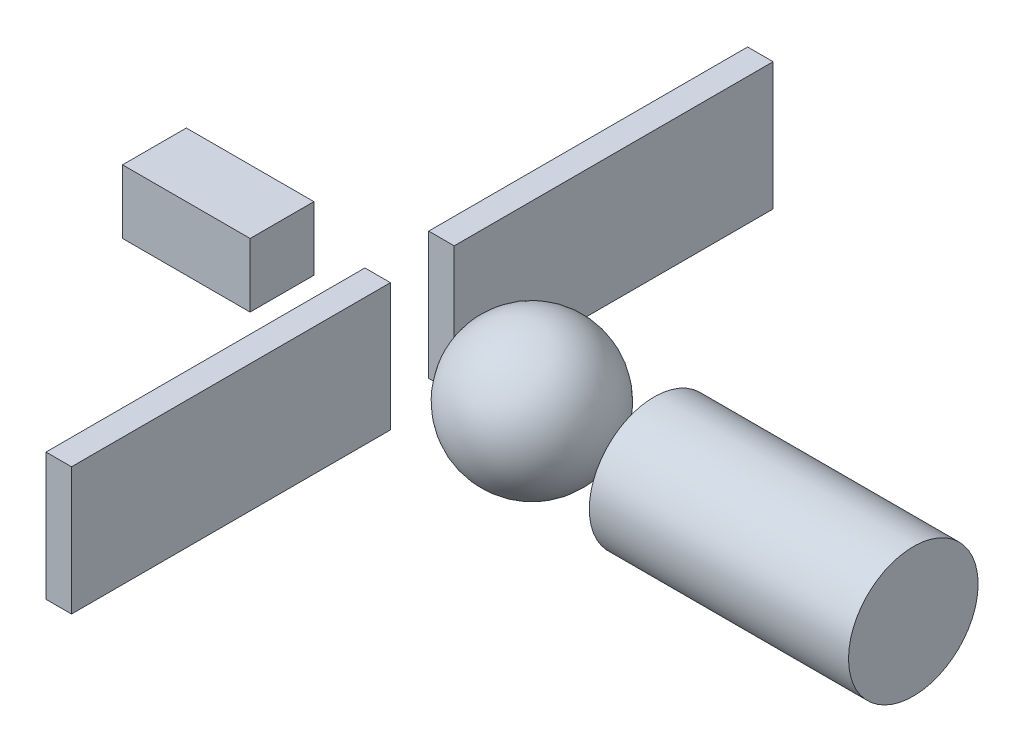
ISO-10303-21;
HEADER;
FILE_DESCRIPTION(('STEP AP214'),'2;1');
FILE_NAME('part.step','',(''),(''),'','','');
FILE_SCHEMA(('AUTOMOTIVE_DESIGN { 1 0 10303 214 1 1 1 1 }'));
ENDSEC;
DATA;
#1=APPLICATION_CONTEXT('core data for automotive mechanical design processes');
#2=APPLICATION_PROTOCOL_DEFINITION('international standard','automotive_design',2000,#1);
#3=PRODUCT_CONTEXT('',#1,'mechanical');
#4=PRODUCT('Part','Part','',(#3));
#5=PRODUCT_RELATED_PRODUCT_CATEGORY('part','',(#4));
#6=PRODUCT_DEFINITION_FORMATION('','',#4);
#7=PRODUCT_DEFINITION_CONTEXT('part definition',#1,'design');
#8=PRODUCT_DEFINITION('design','',#6,#7);
#9=PRODUCT_DEFINITION_SHAPE('','',#8);
#10=(LENGTH_UNIT() NAMED_UNIT(*) SI_UNIT(.MILLI.,.METRE.));
#11=(NAMED_UNIT(*) PLANE_ANGLE_UNIT() SI_UNIT($,.RADIAN.));
#12=(NAMED_UNIT(*) SI_UNIT($,.STERADIAN.) SOLID_ANGLE_UNIT());
#13=UNCERTAINTY_MEASURE_WITH_UNIT(LENGTH_MEASURE(1.E-05),#10,'distance_accuracy_value','');
#14=(GEOMETRIC_REPRESENTATION_CONTEXT(3) GLOBAL_UNCERTAINTY_ASSIGNED_CONTEXT((#13)) GLOBAL_UNIT_ASSIGNED_CONTEXT((#10,
#11,#12)) REPRESENTATION_CONTEXT('',''));
#15=CARTESIAN_POINT('',(0.,0.,0.));
#16=DIRECTION('',(0.,0.,1.));
#17=DIRECTION('',(1.,0.,0.));
#18=AXIS2_PLACEMENT_3D('',#15,#16,#17);
#19=CARTESIAN_POINT('',(9.99999999999998,50.,275.));
#20=DIRECTION('',(-1.,0.,0.));
#21=DIRECTION('',(0.,0.,1.));
#22=AXIS2_PLACEMENT_3D('',#19,#20,#21);
#23=PLANE('',#22);
#24=DIRECTION('',(0.,0.,-1.));
#25=VECTOR('',#24,1.);
#26=CARTESIAN_POINT('',(9.99999999999998,-50.,275.));
#27=LINE('',#26,#25);
#28=CARTESIAN_POINT('',(9.99999999999998,-50.,275.));
#29=VERTEX_POINT('',#28);
#30=CARTESIAN_POINT('',(10.,-50.,25.));
#31=VERTEX_POINT('',#30);
#32=EDGE_CURVE('E107',#29,#31,#27,.T.);
#33=ORIENTED_EDGE('',*,*,#32,.T.);
#34=DIRECTION('',(0.,-1.,0.));
#35=VECTOR('',#34,1.);
#36=CARTESIAN_POINT('',(10.,50.,25.));
#37=LINE('',#36,#35);
#38=CARTESIAN_POINT('',(10.,50.,25.));
#39=VERTEX_POINT('',#38);
#40=EDGE_CURVE('E12',#39,#31,#37,.T.);
#41=ORIENTED_EDGE('',*,*,#40,.F.);
#42=DIRECTION('',(0.,0.,-1.));
#43=VECTOR('',#42,1.);
#44=CARTESIAN_POINT('',(9.99999999999998,50.,275.));
#45=LINE('',#44,#43);
#46=CARTESIAN_POINT('',(9.99999999999998,50.,275.));
#47=VERTEX_POINT('',#46);
#48=EDGE_CURVE('E95',#47,#39,#45,.T.);
#49=ORIENTED_EDGE('',*,*,#48,.F.);
#50=DIRECTION('',(0.,-1.,0.));
#51=VECTOR('',#50,1.);
#52=CARTESIAN_POINT('',(9.99999999999998,50.,275.));
#53=LINE('',#52,#51);
#54=EDGE_CURVE('E103',#47,#29,#53,.T.);
#55=ORIENTED_EDGE('',*,*,#54,.T.);
#56=EDGE_LOOP('',(#33,#41,#49,#55));
#57=FACE_BOUND('',#56,.T.);
#58=ADVANCED_FACE('F44',(#57),#23,.F.);
#59=CARTESIAN_POINT('',(10.,50.,25.));
#60=DIRECTION('',(0.,0.,1.));
#61=DIRECTION('',(1.,0.,0.));
#62=AXIS2_PLACEMENT_3D('',#59,#60,#61);
#63=PLANE('',#62);
#64=DIRECTION('',(-1.,0.,0.));
#65=VECTOR('',#64,1.);
#66=CARTESIAN_POINT('',(10.,-50.,25.));
#67=LINE('',#66,#65);
#68=CARTESIAN_POINT('',(-9.99999999999998,-50.,25.));
#69=VERTEX_POINT('',#68);
#70=EDGE_CURVE('E99',#31,#69,#67,.T.);
#71=ORIENTED_EDGE('',*,*,#70,.T.);
#72=DIRECTION('',(0.,-1.,0.));
#73=VECTOR('',#72,1.);
#74=CARTESIAN_POINT('',(-9.99999999999998,50.,25.));
#75=LINE('',#74,#73);
#76=CARTESIAN_POINT('',(-9.99999999999998,50.,25.));
#77=VERTEX_POINT('',#76);
#78=EDGE_CURVE('E52',#77,#69,#75,.T.);
#79=ORIENTED_EDGE('',*,*,#78,.F.);
#80=DIRECTION('',(-1.,0.,0.));
#81=VECTOR('',#80,1.);
#82=CARTESIAN_POINT('',(10.,50.,25.));
#83=LINE('',#82,#81);
#84=EDGE_CURVE('E90',#39,#77,#83,.T.);
#85=ORIENTED_EDGE('',*,*,#84,.F.);
#86=ORIENTED_EDGE('',*,*,#40,.T.);
#87=EDGE_LOOP('',(#71,#79,#85,#86));
#88=FACE_BOUND('',#87,.T.);
#89=ADVANCED_FACE('F98',(#88),#63,.F.);
#90=CARTESIAN_POINT('',(-10.,50.,275.));
#91=DIRECTION('',(1.,0.,0.));
#92=DIRECTION('',(0.,0.,-1.));
#93=AXIS2_PLACEMENT_3D('',#90,#91,#92);
#94=PLANE('',#93);
#95=DIRECTION('',(0.,0.,1.));
#96=VECTOR('',#95,1.);
#97=CARTESIAN_POINT('',(-10.,-50.,275.));
#98=LINE('',#97,#96);
#99=CARTESIAN_POINT('',(-10.,-50.,275.));
#100=VERTEX_POINT('',#99);
#101=EDGE_CURVE('E77',#69,#100,#98,.T.);
#102=ORIENTED_EDGE('',*,*,#101,.T.);
#103=DIRECTION('',(0.,-1.,0.));
#104=VECTOR('',#103,1.);
#105=CARTESIAN_POINT('',(-10.,50.,275.));
#106=LINE('',#105,#104);
#107=CARTESIAN_POINT('',(-10.,50.,275.));
#108=VERTEX_POINT('',#107);
#109=EDGE_CURVE('E100',#108,#100,#106,.T.);
#110=ORIENTED_EDGE('',*,*,#109,.F.);
#111=DIRECTION('',(0.,0.,1.));
#112=VECTOR('',#111,1.);
#113=CARTESIAN_POINT('',(-10.,50.,275.));
#114=LINE('',#113,#112);
#115=EDGE_CURVE('E93',#77,#108,#114,.T.);
#116=ORIENTED_EDGE('',*,*,#115,.F.);
#117=ORIENTED_EDGE('',*,*,#78,.T.);
#118=EDGE_LOOP('',(#102,#110,#116,#117));
#119=FACE_BOUND('',#118,.T.);
#120=ADVANCED_FACE('F101',(#119),#94,.F.);
#121=CARTESIAN_POINT('',(9.99999999999998,50.,275.));
#122=DIRECTION('',(0.,0.,-1.));
#123=DIRECTION('',(-1.,0.,0.));
#124=AXIS2_PLACEMENT_3D('',#121,#122,#123);
#125=PLANE('',#124);
#126=DIRECTION('',(1.,0.,0.));
#127=VECTOR('',#126,1.);
#128=CARTESIAN_POINT('',(9.99999999999998,-50.,275.));
#129=LINE('',#128,#127);
#130=EDGE_CURVE('E83',#100,#29,#129,.T.);
#131=ORIENTED_EDGE('',*,*,#130,.T.);
#132=ORIENTED_EDGE('',*,*,#54,.F.);
#133=DIRECTION('',(1.,0.,0.));
#134=VECTOR('',#133,1.);
#135=CARTESIAN_POINT('',(9.99999999999998,50.,275.));
#136=LINE('',#135,#134);
#137=EDGE_CURVE('E60',#108,#47,#136,.T.);
#138=ORIENTED_EDGE('',*,*,#137,.F.);
#139=ORIENTED_EDGE('',*,*,#109,.T.);
#140=EDGE_LOOP('',(#131,#132,#138,#139));
#141=FACE_BOUND('',#140,.T.);
#142=ADVANCED_FACE('F114',(#141),#125,.F.);
#143=CARTESIAN_POINT('',(0.,50.,0.));
#144=DIRECTION('',(0.,1.,0.));
#145=DIRECTION('',(0.,0.,1.));
#146=AXIS2_PLACEMENT_3D('',#143,#144,#145);
#147=PLANE('',#146);
#148=ORIENTED_EDGE('',*,*,#48,.T.);
#149=ORIENTED_EDGE('',*,*,#84,.T.);
#150=ORIENTED_EDGE('',*,*,#115,.T.);
#151=ORIENTED_EDGE('',*,*,#137,.T.);
#152=EDGE_LOOP('',(#148,#149,#150,#151));
#153=FACE_BOUND('',#152,.T.);
#154=ADVANCED_FACE('F91',(#153),#147,.T.);
#155=CARTESIAN_POINT('',(0.,-50.,0.));
#156=DIRECTION('',(0.,1.,0.));
#157=DIRECTION('',(0.,0.,1.));
#158=AXIS2_PLACEMENT_3D('',#155,#156,#157);
#159=PLANE('',#158);
#160=ORIENTED_EDGE('',*,*,#32,.F.);
#161=ORIENTED_EDGE('',*,*,#130,.F.);
#162=ORIENTED_EDGE('',*,*,#101,.F.);
#163=ORIENTED_EDGE('',*,*,#70,.F.);
#164=EDGE_LOOP('',(#160,#161,#162,#163));
#165=FACE_BOUND('',#164,.T.);
#166=ADVANCED_FACE('F117',(#165),#159,.F.);
#167=CLOSED_SHELL('',(#58,#89,#120,#142,#154,#166));
#168=MANIFOLD_SOLID_BREP('B2',#167);
#169=CARTESIAN_POINT('',(-10.,50.,-275.));
#170=DIRECTION('',(1.,0.,0.));
#171=DIRECTION('',(0.,0.,-1.));
#172=AXIS2_PLACEMENT_3D('',#169,#170,#171);
#173=PLANE('',#172);
#174=DIRECTION('',(0.,0.,1.));
#175=VECTOR('',#174,1.);
#176=CARTESIAN_POINT('',(-10.,-50.,-275.));
#177=LINE('',#176,#175);
#178=CARTESIAN_POINT('',(-10.,-50.,-275.));
#179=VERTEX_POINT('',#178);
#180=CARTESIAN_POINT('',(-9.99999999999999,-50.,-25.));
#181=VERTEX_POINT('',#180);
#182=EDGE_CURVE('E237',#179,#181,#177,.T.);
#183=ORIENTED_EDGE('',*,*,#182,.T.);
#184=DIRECTION('',(0.,-1.,0.));
#185=VECTOR('',#184,1.);
#186=CARTESIAN_POINT('',(-9.99999999999999,50.,-25.));
#187=LINE('',#186,#185);
#188=CARTESIAN_POINT('',(-9.99999999999999,50.,-25.));
#189=VERTEX_POINT('',#188);
#190=EDGE_CURVE('E42',#189,#181,#187,.T.);
#191=ORIENTED_EDGE('',*,*,#190,.F.);
#192=DIRECTION('',(0.,0.,1.));
#193=VECTOR('',#192,1.);
#194=CARTESIAN_POINT('',(-10.,50.,-275.));
#195=LINE('',#194,#193);
#196=CARTESIAN_POINT('',(-10.,50.,-275.));
#197=VERTEX_POINT('',#196);
#198=EDGE_CURVE('E225',#197,#189,#195,.T.);
#199=ORIENTED_EDGE('',*,*,#198,.F.);
#200=DIRECTION('',(0.,-1.,0.));
#201=VECTOR('',#200,1.);
#202=CARTESIAN_POINT('',(-10.,50.,-275.));
#203=LINE('',#202,#201);
#204=EDGE_CURVE('E233',#197,#179,#203,.T.);
#205=ORIENTED_EDGE('',*,*,#204,.T.);
#206=EDGE_LOOP('',(#183,#191,#199,#205));
#207=FACE_BOUND('',#206,.T.);
#208=ADVANCED_FACE('F174',(#207),#173,.F.);
#209=CARTESIAN_POINT('',(10.,50.,-25.));
#210=DIRECTION('',(0.,0.,-1.));
#211=DIRECTION('',(-1.,0.,0.));
#212=AXIS2_PLACEMENT_3D('',#209,#210,#211);
#213=PLANE('',#212);
#214=DIRECTION('',(1.,0.,0.));
#215=VECTOR('',#214,1.);
#216=CARTESIAN_POINT('',(10.,-50.,-25.));
#217=LINE('',#216,#215);
#218=CARTESIAN_POINT('',(10.,-50.,-25.));
#219=VERTEX_POINT('',#218);
#220=EDGE_CURVE('E229',#181,#219,#217,.T.);
#221=ORIENTED_EDGE('',*,*,#220,.T.);
#222=DIRECTION('',(0.,-1.,0.));
#223=VECTOR('',#222,1.);
#224=CARTESIAN_POINT('',(10.,50.,-25.));
#225=LINE('',#224,#223);
#226=CARTESIAN_POINT('',(10.,50.,-25.));
#227=VERTEX_POINT('',#226);
#228=EDGE_CURVE('E182',#227,#219,#225,.T.);
#229=ORIENTED_EDGE('',*,*,#228,.F.);
#230=DIRECTION('',(1.,0.,0.));
#231=VECTOR('',#230,1.);
#232=CARTESIAN_POINT('',(10.,50.,-25.));
#233=LINE('',#232,#231);
#234=EDGE_CURVE('E220',#189,#227,#233,.T.);
#235=ORIENTED_EDGE('',*,*,#234,.F.);
#236=ORIENTED_EDGE('',*,*,#190,.T.);
#237=EDGE_LOOP('',(#221,#229,#235,#236));
#238=FACE_BOUND('',#237,.T.);
#239=ADVANCED_FACE('F228',(#238),#213,.F.);
#240=CARTESIAN_POINT('',(9.99999999999998,50.,-275.));
#241=DIRECTION('',(-1.,0.,0.));
#242=DIRECTION('',(0.,0.,1.));
#243=AXIS2_PLACEMENT_3D('',#240,#241,#242);
#244=PLANE('',#243);
#245=DIRECTION('',(0.,0.,-1.));
#246=VECTOR('',#245,1.);
#247=CARTESIAN_POINT('',(9.99999999999998,-50.,-275.));
#248=LINE('',#247,#246);
#249=CARTESIAN_POINT('',(9.99999999999998,-50.,-275.));
#250=VERTEX_POINT('',#249);
#251=EDGE_CURVE('E207',#219,#250,#248,.T.);
#252=ORIENTED_EDGE('',*,*,#251,.T.);
#253=DIRECTION('',(0.,-1.,0.));
#254=VECTOR('',#253,1.);
#255=CARTESIAN_POINT('',(9.99999999999998,50.,-275.));
#256=LINE('',#255,#254);
#257=CARTESIAN_POINT('',(9.99999999999998,50.,-275.));
#258=VERTEX_POINT('',#257);
#259=EDGE_CURVE('E230',#258,#250,#256,.T.);
#260=ORIENTED_EDGE('',*,*,#259,.F.);
#261=DIRECTION('',(0.,0.,-1.));
#262=VECTOR('',#261,1.);
#263=CARTESIAN_POINT('',(9.99999999999998,50.,-275.));
#264=LINE('',#263,#262);
#265=EDGE_CURVE('E223',#227,#258,#264,.T.);
#266=ORIENTED_EDGE('',*,*,#265,.F.);
#267=ORIENTED_EDGE('',*,*,#228,.T.);
#268=EDGE_LOOP('',(#252,#260,#266,#267));
#269=FACE_BOUND('',#268,.T.);
#270=ADVANCED_FACE('F231',(#269),#244,.F.);
#271=CARTESIAN_POINT('',(9.99999999999998,50.,-275.));
#272=DIRECTION('',(0.,0.,1.));
#273=DIRECTION('',(1.,0.,0.));
#274=AXIS2_PLACEMENT_3D('',#271,#272,#273);
#275=PLANE('',#274);
#276=DIRECTION('',(-1.,0.,0.));
#277=VECTOR('',#276,1.);
#278=CARTESIAN_POINT('',(9.99999999999998,-50.,-275.));
#279=LINE('',#278,#277);
#280=EDGE_CURVE('E213',#250,#179,#279,.T.);
#281=ORIENTED_EDGE('',*,*,#280,.T.);
#282=ORIENTED_EDGE('',*,*,#204,.F.);
#283=DIRECTION('',(-1.,0.,0.));
#284=VECTOR('',#283,1.);
#285=CARTESIAN_POINT('',(9.99999999999998,50.,-275.));
#286=LINE('',#285,#284);
#287=EDGE_CURVE('E190',#258,#197,#286,.T.);
#288=ORIENTED_EDGE('',*,*,#287,.F.);
#289=ORIENTED_EDGE('',*,*,#259,.T.);
#290=EDGE_LOOP('',(#281,#282,#288,#289));
#291=FACE_BOUND('',#290,.T.);
#292=ADVANCED_FACE('F244',(#291),#275,.F.);
#293=CARTESIAN_POINT('',(0.,50.,0.));
#294=DIRECTION('',(0.,-1.,0.));
#295=DIRECTION('',(0.,0.,-1.));
#296=AXIS2_PLACEMENT_3D('',#293,#294,#295);
#297=PLANE('',#296);
#298=ORIENTED_EDGE('',*,*,#198,.T.);
#299=ORIENTED_EDGE('',*,*,#234,.T.);
#300=ORIENTED_EDGE('',*,*,#265,.T.);
#301=ORIENTED_EDGE('',*,*,#287,.T.);
#302=EDGE_LOOP('',(#298,#299,#300,#301));
#303=FACE_BOUND('',#302,.T.);
#304=ADVANCED_FACE('F221',(#303),#297,.F.);
#305=CARTESIAN_POINT('',(0.,-50.,0.));
#306=DIRECTION('',(0.,-1.,0.));
#307=DIRECTION('',(0.,0.,-1.));
#308=AXIS2_PLACEMENT_3D('',#305,#306,#307);
#309=PLANE('',#308);
#310=ORIENTED_EDGE('',*,*,#182,.F.);
#311=ORIENTED_EDGE('',*,*,#280,.F.);
#312=ORIENTED_EDGE('',*,*,#251,.F.);
#313=ORIENTED_EDGE('',*,*,#220,.F.);
#314=EDGE_LOOP('',(#310,#311,#312,#313));
#315=FACE_BOUND('',#314,.T.);
#316=ADVANCED_FACE('F247',(#315),#309,.T.);
#317=CLOSED_SHELL('',(#208,#239,#270,#292,#304,#316));
#318=MANIFOLD_SOLID_BREP('B6',#317);
#319=CARTESIAN_POINT('',(95.85,0.,0.));
#320=DIRECTION('',(-1.,0.,0.));
#321=DIRECTION('',(0.,0.,-1.));
#322=AXIS2_PLACEMENT_3D('',#319,#320,#321);
#323=SPHERICAL_SURFACE('',#322,55.85);
#324=CARTESIAN_POINT('',(40.,0.,0.));
#325=VERTEX_POINT('',#324);
#326=VERTEX_LOOP('',#325);
#327=FACE_BOUND('',#326,.T.);
#328=ADVANCED_FACE('F306',(#327),#323,.T.);
#329=CLOSED_SHELL('',(#328));
#330=MANIFOLD_SOLID_BREP('B36',#329);
#331=CARTESIAN_POINT('',(394.9,0.,0.));
#332=DIRECTION('',(-1.,0.,0.));
#333=DIRECTION('',(0.,0.,1.));
#334=AXIS2_PLACEMENT_3D('',#331,#332,#333);
#335=PLANE('',#334);
#336=CARTESIAN_POINT('',(394.9,0.,0.));
#337=DIRECTION('',(-1.,0.,0.));
#338=DIRECTION('',(0.,0.,1.));
#339=AXIS2_PLACEMENT_3D('',#336,#337,#338);
#340=CIRCLE('',#339,50.8);
#341=CARTESIAN_POINT('',(394.9,0.,50.8));
#342=VERTEX_POINT('',#341);
#343=EDGE_CURVE('E334',#342,#342,#340,.T.);
#344=ORIENTED_EDGE('',*,*,#343,.F.);
#345=EDGE_LOOP('',(#344));
#346=FACE_BOUND('',#345,.T.);
#347=ADVANCED_FACE('F328',(#346),#335,.F.);
#348=CARTESIAN_POINT('',(191.7,0.,0.));
#349=DIRECTION('',(1.,0.,0.));
#350=DIRECTION('',(0.,0.,-1.));
#351=AXIS2_PLACEMENT_3D('',#348,#349,#350);
#352=PLANE('',#351);
#353=CARTESIAN_POINT('',(191.7,0.,0.));
#354=DIRECTION('',(-1.,0.,0.));
#355=DIRECTION('',(0.,0.,1.));
#356=AXIS2_PLACEMENT_3D('',#353,#354,#355);
#357=CIRCLE('',#356,50.8);
#358=CARTESIAN_POINT('',(191.7,0.,50.8));
#359=VERTEX_POINT('',#358);
#360=EDGE_CURVE('E305',#359,#359,#357,.T.);
#361=ORIENTED_EDGE('',*,*,#360,.T.);
#362=EDGE_LOOP('',(#361));
#363=FACE_BOUND('',#362,.T.);
#364=ADVANCED_FACE('F343',(#363),#352,.F.);
#365=CARTESIAN_POINT('',(0.,0.,0.));
#366=DIRECTION('',(-1.,0.,0.));
#367=DIRECTION('',(0.,0.,1.));
#368=AXIS2_PLACEMENT_3D('',#365,#366,#367);
#369=CYLINDRICAL_SURFACE('',#368,50.8);
#370=ORIENTED_EDGE('',*,*,#360,.F.);
#371=EDGE_LOOP('',(#370));
#372=FACE_BOUND('',#371,.T.);
#373=ORIENTED_EDGE('',*,*,#343,.T.);
#374=EDGE_LOOP('',(#373));
#375=FACE_BOUND('',#374,.T.);
#376=ADVANCED_FACE('F340',(#372,#375),#369,.T.);
#377=CLOSED_SHELL('',(#347,#364,#376));
#378=MANIFOLD_SOLID_BREP('B170',#377);
#379=CARTESIAN_POINT('',(-100.,-25.,25.));
#380=DIRECTION('',(-1.,0.,0.));
#381=DIRECTION('',(0.,0.,1.));
#382=AXIS2_PLACEMENT_3D('',#379,#380,#381);
#383=PLANE('',#382);
#384=DIRECTION('',(0.,1.,0.));
#385=VECTOR('',#384,1.);
#386=CARTESIAN_POINT('',(-100.,-25.,-25.));
#387=LINE('',#386,#385);
#388=CARTESIAN_POINT('',(-100.,-25.,-25.));
#389=VERTEX_POINT('',#388);
#390=CARTESIAN_POINT('',(-100.,25.,-25.));
#391=VERTEX_POINT('',#390);
#392=EDGE_CURVE('E432',#389,#391,#387,.T.);
#393=ORIENTED_EDGE('',*,*,#392,.T.);
#394=DIRECTION('',(0.,0.,-1.));
#395=VECTOR('',#394,1.);
#396=CARTESIAN_POINT('',(-100.,25.,25.));
#397=LINE('',#396,#395);
#398=CARTESIAN_POINT('',(-100.,25.,25.));
#399=VERTEX_POINT('',#398);
#400=EDGE_CURVE('E326',#399,#391,#397,.T.);
#401=ORIENTED_EDGE('',*,*,#400,.F.);
#402=DIRECTION('',(0.,1.,0.));
#403=VECTOR('',#402,1.);
#404=CARTESIAN_POINT('',(-100.,-25.,25.));
#405=LINE('',#404,#403);
#406=CARTESIAN_POINT('',(-100.,-25.,25.));
#407=VERTEX_POINT('',#406);
#408=EDGE_CURVE('E420',#407,#399,#405,.T.);
#409=ORIENTED_EDGE('',*,*,#408,.F.);
#410=DIRECTION('',(0.,0.,-1.));
#411=VECTOR('',#410,1.);
#412=CARTESIAN_POINT('',(-100.,-25.,25.));
#413=LINE('',#412,#411);
#414=EDGE_CURVE('E428',#407,#389,#413,.T.);
#415=ORIENTED_EDGE('',*,*,#414,.T.);
#416=EDGE_LOOP('',(#393,#401,#409,#415));
#417=FACE_BOUND('',#416,.T.);
#418=ADVANCED_FACE('F369',(#417),#383,.F.);
#419=CARTESIAN_POINT('',(-200.,25.,25.));
#420=DIRECTION('',(0.,-1.,0.));
#421=DIRECTION('',(0.,0.,-1.));
#422=AXIS2_PLACEMENT_3D('',#419,#420,#421);
#423=PLANE('',#422);
#424=DIRECTION('',(-1.,0.,0.));
#425=VECTOR('',#424,1.);
#426=CARTESIAN_POINT('',(-200.,25.,-25.));
#427=LINE('',#426,#425);
#428=CARTESIAN_POINT('',(-200.,25.,-25.));
#429=VERTEX_POINT('',#428);
#430=EDGE_CURVE('E424',#391,#429,#427,.T.);
#431=ORIENTED_EDGE('',*,*,#430,.T.);
#432=DIRECTION('',(0.,0.,-1.));
#433=VECTOR('',#432,1.);
#434=CARTESIAN_POINT('',(-200.,25.,25.));
#435=LINE('',#434,#433);
#436=CARTESIAN_POINT('',(-200.,25.,25.));
#437=VERTEX_POINT('',#436);
#438=EDGE_CURVE('E377',#437,#429,#435,.T.);
#439=ORIENTED_EDGE('',*,*,#438,.F.);
#440=DIRECTION('',(-1.,0.,0.));
#441=VECTOR('',#440,1.);
#442=CARTESIAN_POINT('',(-200.,25.,25.));
#443=LINE('',#442,#441);
#444=EDGE_CURVE('E415',#399,#437,#443,.T.);
#445=ORIENTED_EDGE('',*,*,#444,.F.);
#446=ORIENTED_EDGE('',*,*,#400,.T.);
#447=EDGE_LOOP('',(#431,#439,#445,#446));
#448=FACE_BOUND('',#447,.T.);
#449=ADVANCED_FACE('F423',(#448),#423,.F.);
#450=CARTESIAN_POINT('',(-200.,-25.,25.));
#451=DIRECTION('',(1.,0.,0.));
#452=DIRECTION('',(0.,0.,-1.));
#453=AXIS2_PLACEMENT_3D('',#450,#451,#452);
#454=PLANE('',#453);
#455=DIRECTION('',(0.,-1.,0.));
#456=VECTOR('',#455,1.);
#457=CARTESIAN_POINT('',(-200.,-25.,-25.));
#458=LINE('',#457,#456);
#459=CARTESIAN_POINT('',(-200.,-25.,-25.));
#460=VERTEX_POINT('',#459);
#461=EDGE_CURVE('E402',#429,#460,#458,.T.);
#462=ORIENTED_EDGE('',*,*,#461,.T.);
#463=DIRECTION('',(0.,0.,-1.));
#464=VECTOR('',#463,1.);
#465=CARTESIAN_POINT('',(-200.,-25.,25.));
#466=LINE('',#465,#464);
#467=CARTESIAN_POINT('',(-200.,-25.,25.));
#468=VERTEX_POINT('',#467);
#469=EDGE_CURVE('E425',#468,#460,#466,.T.);
#470=ORIENTED_EDGE('',*,*,#469,.F.);
#471=DIRECTION('',(0.,-1.,0.));
#472=VECTOR('',#471,1.);
#473=CARTESIAN_POINT('',(-200.,-25.,25.));
#474=LINE('',#473,#472);
#475=EDGE_CURVE('E418',#437,#468,#474,.T.);
#476=ORIENTED_EDGE('',*,*,#475,.F.);
#477=ORIENTED_EDGE('',*,*,#438,.T.);
#478=EDGE_LOOP('',(#462,#470,#476,#477));
#479=FACE_BOUND('',#478,.T.);
#480=ADVANCED_FACE('F426',(#479),#454,.F.);
#481=CARTESIAN_POINT('',(-200.,-25.,25.));
#482=DIRECTION('',(0.,1.,0.));
#483=DIRECTION('',(0.,0.,1.));
#484=AXIS2_PLACEMENT_3D('',#481,#482,#483);
#485=PLANE('',#484);
#486=DIRECTION('',(1.,0.,0.));
#487=VECTOR('',#486,1.);
#488=CARTESIAN_POINT('',(-200.,-25.,-25.));
#489=LINE('',#488,#487);
#490=EDGE_CURVE('E408',#460,#389,#489,.T.);
#491=ORIENTED_EDGE('',*,*,#490,.T.);
#492=ORIENTED_EDGE('',*,*,#414,.F.);
#493=DIRECTION('',(1.,0.,0.));
#494=VECTOR('',#493,1.);
#495=CARTESIAN_POINT('',(-200.,-25.,25.));
#496=LINE('',#495,#494);
#497=EDGE_CURVE('E385',#468,#407,#496,.T.);
#498=ORIENTED_EDGE('',*,*,#497,.F.);
#499=ORIENTED_EDGE('',*,*,#469,.T.);
#500=EDGE_LOOP('',(#491,#492,#498,#499));
#501=FACE_BOUND('',#500,.T.);
#502=ADVANCED_FACE('F439',(#501),#485,.F.);
#503=CARTESIAN_POINT('',(0.,0.,25.));
#504=DIRECTION('',(0.,0.,-1.));
#505=DIRECTION('',(-1.,0.,0.));
#506=AXIS2_PLACEMENT_3D('',#503,#504,#505);
#507=PLANE('',#506);
#508=ORIENTED_EDGE('',*,*,#408,.T.);
#509=ORIENTED_EDGE('',*,*,#444,.T.);
#510=ORIENTED_EDGE('',*,*,#475,.T.);
#511=ORIENTED_EDGE('',*,*,#497,.T.);
#512=EDGE_LOOP('',(#508,#509,#510,#511));
#513=FACE_BOUND('',#512,.T.);
#514=ADVANCED_FACE('F416',(#513),#507,.F.);
#515=CARTESIAN_POINT('',(0.,0.,-25.));
#516=DIRECTION('',(0.,0.,-1.));
#517=DIRECTION('',(-1.,0.,0.));
#518=AXIS2_PLACEMENT_3D('',#515,#516,#517);
#519=PLANE('',#518);
#520=ORIENTED_EDGE('',*,*,#392,.F.);
#521=ORIENTED_EDGE('',*,*,#490,.F.);
#522=ORIENTED_EDGE('',*,*,#461,.F.);
#523=ORIENTED_EDGE('',*,*,#430,.F.);
#524=EDGE_LOOP('',(#520,#521,#522,#523));
#525=FACE_BOUND('',#524,.T.);
#526=ADVANCED_FACE('F442',(#525),#519,.T.);
#527=CLOSED_SHELL('',(#418,#449,#480,#502,#514,#526));
#528=MANIFOLD_SOLID_BREP('B300',#527);
#529=ADVANCED_BREP_SHAPE_REPRESENTATION('',(#18,#168,#318,#330,#378,#528),#14);
#530=SHAPE_DEFINITION_REPRESENTATION(#9,#529);
ENDSEC;
END-ISO-10303-21;
